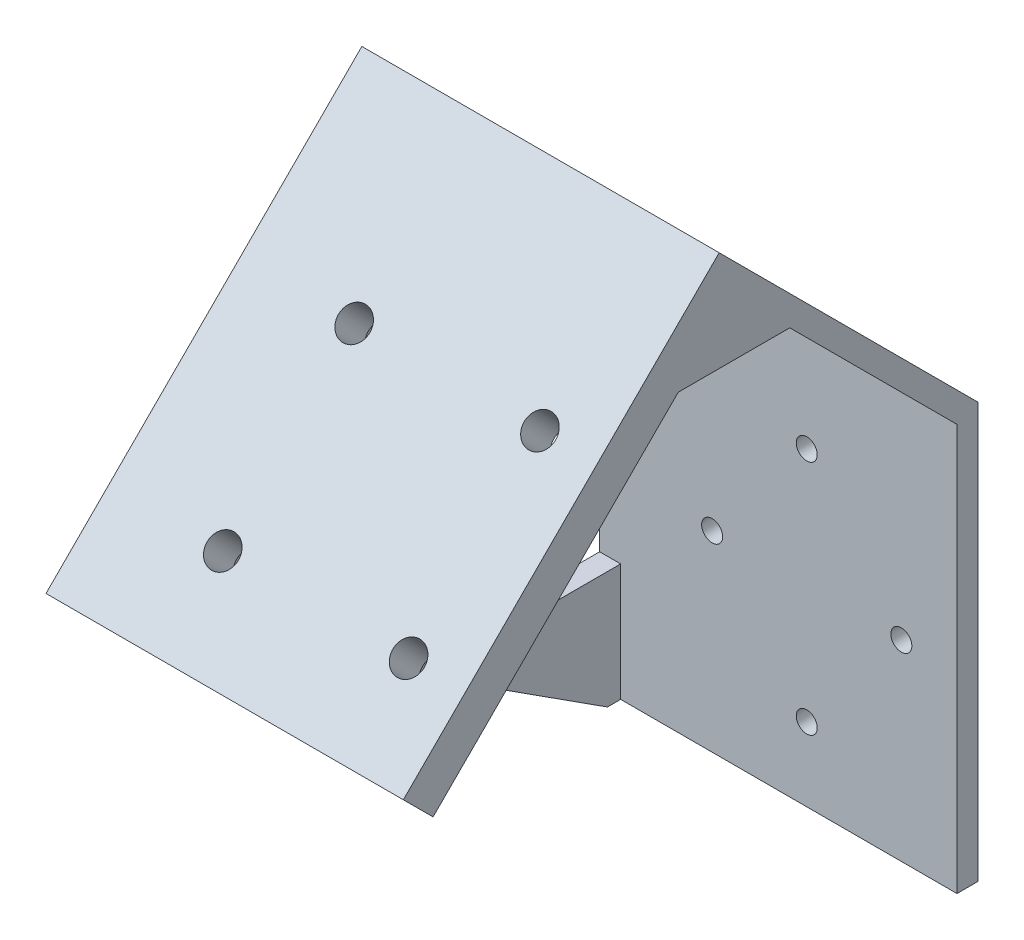
ISO-10303-21;
HEADER;
FILE_DESCRIPTION(('STEP AP214'),'2;1');
FILE_NAME('part.step','',(''),(''),'','','');
FILE_SCHEMA(('AUTOMOTIVE_DESIGN { 1 0 10303 214 1 1 1 1 }'));
ENDSEC;
DATA;
#1=APPLICATION_CONTEXT('core data for automotive mechanical design processes');
#2=APPLICATION_PROTOCOL_DEFINITION('international standard','automotive_design',2000,#1);
#3=PRODUCT_CONTEXT('',#1,'mechanical');
#4=PRODUCT('Part','Part','',(#3));
#5=PRODUCT_RELATED_PRODUCT_CATEGORY('part','',(#4));
#6=PRODUCT_DEFINITION_FORMATION('','',#4);
#7=PRODUCT_DEFINITION_CONTEXT('part definition',#1,'design');
#8=PRODUCT_DEFINITION('design','',#6,#7);
#9=PRODUCT_DEFINITION_SHAPE('','',#8);
#10=(LENGTH_UNIT() NAMED_UNIT(*) SI_UNIT(.MILLI.,.METRE.));
#11=(NAMED_UNIT(*) PLANE_ANGLE_UNIT() SI_UNIT($,.RADIAN.));
#12=(NAMED_UNIT(*) SI_UNIT($,.STERADIAN.) SOLID_ANGLE_UNIT());
#13=UNCERTAINTY_MEASURE_WITH_UNIT(LENGTH_MEASURE(1.E-05),#10,'distance_accuracy_value','');
#14=(GEOMETRIC_REPRESENTATION_CONTEXT(3) GLOBAL_UNCERTAINTY_ASSIGNED_CONTEXT((#13)) GLOBAL_UNIT_ASSIGNED_CONTEXT((#10,
#11,#12)) REPRESENTATION_CONTEXT('',''));
#15=CARTESIAN_POINT('',(0.,0.,0.));
#16=DIRECTION('',(0.,0.,1.));
#17=DIRECTION('',(1.,0.,0.));
#18=AXIS2_PLACEMENT_3D('',#15,#16,#17);
#19=CARTESIAN_POINT('',(-27.,10.5667806250409,-22.3044335614669));
#20=DIRECTION('',(0.,-1.,0.));
#21=DIRECTION('',(0.,0.,-1.));
#22=AXIS2_PLACEMENT_3D('',#19,#20,#21);
#23=PLANE('',#22);
#24=DIRECTION('',(1.,0.,0.));
#25=VECTOR('',#24,1.);
#26=CARTESIAN_POINT('',(-27.,10.5667806250409,-26.3044335614669));
#27=LINE('',#26,#25);
#28=CARTESIAN_POINT('',(-31.,10.5667806250409,-26.3044335614669));
#29=VERTEX_POINT('',#28);
#30=CARTESIAN_POINT('',(37.,10.5667806250409,-26.3044335614669));
#31=VERTEX_POINT('',#30);
#32=EDGE_CURVE('E271',#29,#31,#27,.T.);
#33=ORIENTED_EDGE('',*,*,#32,.T.);
#34=DIRECTION('',(0.,0.,-1.));
#35=VECTOR('',#34,1.);
#36=CARTESIAN_POINT('',(37.,10.5667806250409,-22.3044335614669));
#37=LINE('',#36,#35);
#38=CARTESIAN_POINT('',(37.,10.5667806250409,-22.3044335614669));
#39=VERTEX_POINT('',#38);
#40=EDGE_CURVE('E206',#39,#31,#37,.T.);
#41=ORIENTED_EDGE('',*,*,#40,.F.);
#42=DIRECTION('',(1.,0.,0.));
#43=VECTOR('',#42,1.);
#44=CARTESIAN_POINT('',(-27.,10.5667806250409,-22.3044335614669));
#45=LINE('',#44,#43);
#46=CARTESIAN_POINT('',(-27.,10.5667806250409,-22.3044335614665));
#47=VERTEX_POINT('',#46);
#48=EDGE_CURVE('E272',#47,#39,#45,.T.);
#49=ORIENTED_EDGE('',*,*,#48,.F.);
#50=DIRECTION('',(0.,0.,1.));
#51=VECTOR('',#50,1.);
#52=CARTESIAN_POINT('',(-27.,10.5667806250409,0.));
#53=LINE('',#52,#51);
#54=CARTESIAN_POINT('',(-27.,10.5667806250409,-19.7923121002212));
#55=VERTEX_POINT('',#54);
#56=EDGE_CURVE('E184',#47,#55,#53,.T.);
#57=ORIENTED_EDGE('',*,*,#56,.T.);
#58=DIRECTION('',(1.,0.,0.));
#59=VECTOR('',#58,1.);
#60=CARTESIAN_POINT('',(-31.,10.5667806250409,-19.7923121002212));
#61=LINE('',#60,#59);
#62=CARTESIAN_POINT('',(-31.,10.5667806250409,-19.7923121002212));
#63=VERTEX_POINT('',#62);
#64=EDGE_CURVE('E190',#63,#55,#61,.T.);
#65=ORIENTED_EDGE('',*,*,#64,.F.);
#66=DIRECTION('',(0.,0.,1.));
#67=VECTOR('',#66,1.);
#68=CARTESIAN_POINT('',(-31.,10.5667806250409,0.));
#69=LINE('',#68,#67);
#70=EDGE_CURVE('E324',#29,#63,#69,.T.);
#71=ORIENTED_EDGE('',*,*,#70,.F.);
#72=EDGE_LOOP('',(#33,#41,#49,#57,#65,#71));
#73=FACE_BOUND('',#72,.T.);
#74=ADVANCED_FACE('F49',(#73),#23,.T.);
#75=CARTESIAN_POINT('',(-27.,10.5667806250409,-22.3044335614669));
#76=DIRECTION('',(0.,0.,1.));
#77=DIRECTION('',(0.,-1.,0.));
#78=AXIS2_PLACEMENT_3D('',#75,#76,#77);
#79=PLANE('',#78);
#80=CARTESIAN_POINT('',(8.41,69.5667806250409,-22.3044335614671));
#81=DIRECTION('',(0.,0.,1.));
#82=DIRECTION('',(1.,0.,0.));
#83=AXIS2_PLACEMENT_3D('',#80,#81,#82);
#84=CIRCLE('',#83,2.);
#85=CARTESIAN_POINT('',(10.41,69.5667806250409,-22.3044335614671));
#86=VERTEX_POINT('',#85);
#87=EDGE_CURVE('E207',#86,#86,#84,.T.);
#88=ORIENTED_EDGE('',*,*,#87,.F.);
#89=EDGE_LOOP('',(#88));
#90=FACE_BOUND('',#89,.T.);
#91=CARTESIAN_POINT('',(26.41,47.0667806250409,-22.3044335614671));
#92=DIRECTION('',(0.,0.,1.));
#93=DIRECTION('',(1.,0.,0.));
#94=AXIS2_PLACEMENT_3D('',#91,#92,#93);
#95=CIRCLE('',#94,2.00000000000001);
#96=CARTESIAN_POINT('',(28.41,47.0667806250409,-22.3044335614671));
#97=VERTEX_POINT('',#96);
#98=EDGE_CURVE('E211',#97,#97,#95,.T.);
#99=ORIENTED_EDGE('',*,*,#98,.F.);
#100=EDGE_LOOP('',(#99));
#101=FACE_BOUND('',#100,.T.);
#102=CARTESIAN_POINT('',(8.41,24.5667806250409,-22.3044335614671));
#103=DIRECTION('',(0.,0.,1.));
#104=DIRECTION('',(1.,0.,0.));
#105=AXIS2_PLACEMENT_3D('',#102,#103,#104);
#106=CIRCLE('',#105,2.);
#107=CARTESIAN_POINT('',(10.41,24.5667806250409,-22.3044335614671));
#108=VERTEX_POINT('',#107);
#109=EDGE_CURVE('E219',#108,#108,#106,.T.);
#110=ORIENTED_EDGE('',*,*,#109,.F.);
#111=EDGE_LOOP('',(#110));
#112=FACE_BOUND('',#111,.T.);
#113=CARTESIAN_POINT('',(-9.59000000000001,47.0667806250409,-22.3044335614671));
#114=DIRECTION('',(0.,0.,1.));
#115=DIRECTION('',(1.,0.,0.));
#116=AXIS2_PLACEMENT_3D('',#113,#114,#115);
#117=CIRCLE('',#116,2.);
#118=CARTESIAN_POINT('',(-7.59,47.0667806250409,-22.3044335614671));
#119=VERTEX_POINT('',#118);
#120=EDGE_CURVE('E227',#119,#119,#117,.T.);
#121=ORIENTED_EDGE('',*,*,#120,.F.);
#122=EDGE_LOOP('',(#121));
#123=FACE_BOUND('',#122,.T.);
#124=ORIENTED_EDGE('',*,*,#48,.T.);
#125=DIRECTION('',(0.,-1.,0.));
#126=VECTOR('',#125,1.);
#127=CARTESIAN_POINT('',(37.,10.5667806250409,-22.3044335614669));
#128=LINE('',#127,#126);
#129=CARTESIAN_POINT('',(37.,87.8961406723631,-22.3044335614661));
#130=VERTEX_POINT('',#129);
#131=EDGE_CURVE('E261',#130,#39,#128,.T.);
#132=ORIENTED_EDGE('',*,*,#131,.F.);
#133=DIRECTION('',(1.,0.,0.));
#134=VECTOR('',#133,1.);
#135=CARTESIAN_POINT('',(-27.,87.8961406723631,-22.3044335614661));
#136=LINE('',#135,#134);
#137=CARTESIAN_POINT('',(-27.,87.8961406723631,-22.3044335614661));
#138=VERTEX_POINT('',#137);
#139=EDGE_CURVE('E276',#138,#130,#136,.T.);
#140=ORIENTED_EDGE('',*,*,#139,.F.);
#141=DIRECTION('',(1.,0.,0.));
#142=VECTOR('',#141,1.);
#143=CARTESIAN_POINT('',(-31.,87.8961406723631,-22.3044335614661));
#144=LINE('',#143,#142);
#145=CARTESIAN_POINT('',(-31.,87.8961406723631,-22.3044335614661));
#146=VERTEX_POINT('',#145);
#147=EDGE_CURVE('E168',#146,#138,#144,.T.);
#148=ORIENTED_EDGE('',*,*,#147,.F.);
#149=DIRECTION('',(0.,1.,0.));
#150=VECTOR('',#149,1.);
#151=CARTESIAN_POINT('',(-31.,2.38168318721785E-13,-22.3044335614671));
#152=LINE('',#151,#150);
#153=CARTESIAN_POINT('',(-31.,32.8961406723631,-22.3044335614667));
#154=VERTEX_POINT('',#153);
#155=EDGE_CURVE('E159',#154,#146,#152,.T.);
#156=ORIENTED_EDGE('',*,*,#155,.F.);
#157=DIRECTION('',(1.,0.,0.));
#158=VECTOR('',#157,1.);
#159=CARTESIAN_POINT('',(-31.,32.8961406723631,-22.3044335614667));
#160=LINE('',#159,#158);
#161=CARTESIAN_POINT('',(-27.,32.8961406723631,-22.3044335614667));
#162=VERTEX_POINT('',#161);
#163=EDGE_CURVE('E164',#154,#162,#160,.T.);
#164=ORIENTED_EDGE('',*,*,#163,.T.);
#165=DIRECTION('',(0.,-1.,0.));
#166=VECTOR('',#165,1.);
#167=CARTESIAN_POINT('',(-27.,10.5667806250409,-22.3044335614669));
#168=LINE('',#167,#166);
#169=EDGE_CURVE('E268',#162,#47,#168,.T.);
#170=ORIENTED_EDGE('',*,*,#169,.T.);
#171=EDGE_LOOP('',(#124,#132,#140,#148,#156,#164,#170));
#172=FACE_BOUND('',#171,.T.);
#173=ADVANCED_FACE('F161',(#90,#101,#112,#123,#172),#79,.T.);
#174=CARTESIAN_POINT('',(-27.,130.322547543556,20.1219733097267));
#175=DIRECTION('',(0.,-0.707106781186548,0.707106781186548));
#176=DIRECTION('',(0.,-0.707106781186548,-0.707106781186548));
#177=AXIS2_PLACEMENT_3D('',#174,#175,#176);
#178=PLANE('',#177);
#179=DIRECTION('',(0.,-0.707106781186547,-0.707106781186547));
#180=VECTOR('',#179,1.);
#181=CARTESIAN_POINT('',(37.,130.322547543556,20.1219733097267));
#182=LINE('',#181,#180);
#183=CARTESIAN_POINT('',(37.,119.715945825758,9.51537159192855));
#184=VERTEX_POINT('',#183);
#185=EDGE_CURVE('E258',#184,#130,#182,.T.);
#186=ORIENTED_EDGE('',*,*,#185,.F.);
#187=DIRECTION('',(-1.,0.,0.));
#188=VECTOR('',#187,1.);
#189=CARTESIAN_POINT('',(-27.,119.715945825758,9.51537159192855));
#190=LINE('',#189,#188);
#191=CARTESIAN_POINT('',(-27.,119.715945825758,9.51537159192855));
#192=VERTEX_POINT('',#191);
#193=EDGE_CURVE('E295',#184,#192,#190,.T.);
#194=ORIENTED_EDGE('',*,*,#193,.T.);
#195=DIRECTION('',(0.,-0.707106781186547,-0.707106781186547));
#196=VECTOR('',#195,1.);
#197=CARTESIAN_POINT('',(-27.,130.322547543556,20.1219733097267));
#198=LINE('',#197,#196);
#199=EDGE_CURVE('E265',#192,#138,#198,.T.);
#200=ORIENTED_EDGE('',*,*,#199,.T.);
#201=ORIENTED_EDGE('',*,*,#139,.T.);
#202=EDGE_LOOP('',(#186,#194,#200,#201));
#203=FACE_BOUND('',#202,.T.);
#204=ADVANCED_FACE('F399',(#203),#178,.T.);
#205=CARTESIAN_POINT('',(-27.,73.0468982674459,77.3976225858368));
#206=DIRECTION('',(0.,-0.707106781186548,-0.707106781186547));
#207=DIRECTION('',(0.,0.707106781186547,-0.707106781186548));
#208=AXIS2_PLACEMENT_3D('',#205,#206,#207);
#209=PLANE('',#208);
#210=CARTESIAN_POINT('',(26.0876695296637,109.958724290234,40.4857965630484));
#211=DIRECTION('',(0.,-0.707106781186548,-0.707106781186547));
#212=DIRECTION('',(0.,0.707106781186547,-0.707106781186548));
#213=AXIS2_PLACEMENT_3D('',#210,#211,#212);
#214=CIRCLE('',#213,3.00000000000001);
#215=CARTESIAN_POINT('',(26.0876695296637,112.080044633794,38.3644762194888));
#216=VERTEX_POINT('',#215);
#217=EDGE_CURVE('E372',#216,#216,#214,.F.);
#218=ORIENTED_EDGE('',*,*,#217,.T.);
#219=EDGE_LOOP('',(#218));
#220=FACE_BOUND('',#219,.T.);
#221=CARTESIAN_POINT('',(26.0876695296637,84.9587242902343,65.4857965630484));
#222=DIRECTION('',(0.,-0.707106781186548,-0.707106781186547));
#223=DIRECTION('',(0.,0.707106781186547,-0.707106781186548));
#224=AXIS2_PLACEMENT_3D('',#221,#222,#223);
#225=CIRCLE('',#224,3.00000000000001);
#226=CARTESIAN_POINT('',(26.0876695296637,87.0800446337939,63.3644762194888));
#227=VERTEX_POINT('',#226);
#228=EDGE_CURVE('E333',#227,#227,#225,.F.);
#229=ORIENTED_EDGE('',*,*,#228,.T.);
#230=EDGE_LOOP('',(#229));
#231=FACE_BOUND('',#230,.T.);
#232=CARTESIAN_POINT('',(-9.26766952966368,84.9587242902343,65.4857965630484));
#233=DIRECTION('',(0.,-0.707106781186548,-0.707106781186547));
#234=DIRECTION('',(0.,0.707106781186547,-0.707106781186548));
#235=AXIS2_PLACEMENT_3D('',#232,#233,#234);
#236=CIRCLE('',#235,3.);
#237=CARTESIAN_POINT('',(-9.26766952966368,87.0800446337939,63.3644762194888));
#238=VERTEX_POINT('',#237);
#239=EDGE_CURVE('E331',#238,#238,#236,.F.);
#240=ORIENTED_EDGE('',*,*,#239,.T.);
#241=EDGE_LOOP('',(#240));
#242=FACE_BOUND('',#241,.T.);
#243=CARTESIAN_POINT('',(-9.2676695296637,109.958724290234,40.4857965630484));
#244=DIRECTION('',(0.,-0.707106781186548,-0.707106781186547));
#245=DIRECTION('',(0.,0.707106781186547,-0.707106781186548));
#246=AXIS2_PLACEMENT_3D('',#243,#244,#245);
#247=CIRCLE('',#246,3.00000000000001);
#248=CARTESIAN_POINT('',(-9.2676695296637,112.080044633794,38.3644762194888));
#249=VERTEX_POINT('',#248);
#250=EDGE_CURVE('E334',#249,#249,#247,.F.);
#251=ORIENTED_EDGE('',*,*,#250,.T.);
#252=EDGE_LOOP('',(#251));
#253=FACE_BOUND('',#252,.T.);
#254=DIRECTION('',(1.,0.,0.));
#255=VECTOR('',#254,1.);
#256=CARTESIAN_POINT('',(-27.,73.0468982674459,77.3976225858368));
#257=LINE('',#256,#255);
#258=CARTESIAN_POINT('',(-16.9999999999999,73.0468982674459,77.3976225858368));
#259=VERTEX_POINT('',#258);
#260=CARTESIAN_POINT('',(37.,73.0468982674459,77.3976225858368));
#261=VERTEX_POINT('',#260);
#262=EDGE_CURVE('E279',#259,#261,#257,.T.);
#263=ORIENTED_EDGE('',*,*,#262,.F.);
#264=DIRECTION('',(0.,0.707106781186547,-0.707106781186548));
#265=VECTOR('',#264,1.);
#266=CARTESIAN_POINT('',(-16.9999999999999,73.0468982674459,77.3976225858368));
#267=LINE('',#266,#265);
#268=CARTESIAN_POINT('',(-16.9999999999999,119.715945825758,30.728575027525));
#269=VERTEX_POINT('',#268);
#270=EDGE_CURVE('E304',#259,#269,#267,.T.);
#271=ORIENTED_EDGE('',*,*,#270,.T.);
#272=DIRECTION('',(1.,0.,0.));
#273=VECTOR('',#272,1.);
#274=CARTESIAN_POINT('',(37.,119.715945825758,30.728575027525));
#275=LINE('',#274,#273);
#276=CARTESIAN_POINT('',(37.,119.715945825758,30.728575027525));
#277=VERTEX_POINT('',#276);
#278=EDGE_CURVE('E275',#269,#277,#275,.T.);
#279=ORIENTED_EDGE('',*,*,#278,.T.);
#280=DIRECTION('',(0.,0.707106781186547,-0.707106781186548));
#281=VECTOR('',#280,1.);
#282=CARTESIAN_POINT('',(37.,73.0468982674459,77.3976225858368));
#283=LINE('',#282,#281);
#284=EDGE_CURVE('E254',#261,#277,#283,.T.);
#285=ORIENTED_EDGE('',*,*,#284,.F.);
#286=EDGE_LOOP('',(#263,#271,#279,#285));
#287=FACE_BOUND('',#286,.T.);
#288=ADVANCED_FACE('F424',(#220,#231,#242,#253,#287),#209,.T.);
#289=CARTESIAN_POINT('',(-27.,78.7037525169383,83.0544768353292));
#290=DIRECTION('',(0.,-0.707106781186548,0.707106781186547));
#291=DIRECTION('',(0.,-0.707106781186547,-0.707106781186548));
#292=AXIS2_PLACEMENT_3D('',#289,#290,#291);
#293=PLANE('',#292);
#294=DIRECTION('',(1.,0.,0.));
#295=VECTOR('',#294,1.);
#296=CARTESIAN_POINT('',(-31.,73.0468982674459,77.3976225858368));
#297=LINE('',#296,#295);
#298=CARTESIAN_POINT('',(-31.,73.0468982674459,77.3976225858368));
#299=VERTEX_POINT('',#298);
#300=EDGE_CURVE('E66',#299,#259,#297,.T.);
#301=ORIENTED_EDGE('',*,*,#300,.T.);
#302=ORIENTED_EDGE('',*,*,#262,.T.);
#303=DIRECTION('',(0.,-0.707106781186547,-0.707106781186548));
#304=VECTOR('',#303,1.);
#305=CARTESIAN_POINT('',(37.,78.7037525169383,83.0544768353292));
#306=LINE('',#305,#304);
#307=CARTESIAN_POINT('',(37.,78.7037525169383,83.0544768353292));
#308=VERTEX_POINT('',#307);
#309=EDGE_CURVE('E250',#308,#261,#306,.T.);
#310=ORIENTED_EDGE('',*,*,#309,.F.);
#311=DIRECTION('',(1.,0.,0.));
#312=VECTOR('',#311,1.);
#313=CARTESIAN_POINT('',(-27.,78.7037525169383,83.0544768353292));
#314=LINE('',#313,#312);
#315=CARTESIAN_POINT('',(-31.,78.7037525169383,83.0544768353292));
#316=VERTEX_POINT('',#315);
#317=EDGE_CURVE('E282',#316,#308,#314,.T.);
#318=ORIENTED_EDGE('',*,*,#317,.F.);
#319=DIRECTION('',(0.,0.707106781186547,0.707106781186548));
#320=VECTOR('',#319,1.);
#321=CARTESIAN_POINT('',(-31.,-2.17536215919535,2.17536215919535));
#322=LINE('',#321,#320);
#323=EDGE_CURVE('E351',#299,#316,#322,.T.);
#324=ORIENTED_EDGE('',*,*,#323,.F.);
#325=EDGE_LOOP('',(#301,#302,#310,#318,#324));
#326=FACE_BOUND('',#325,.T.);
#327=ADVANCED_FACE('F420',(#326),#293,.T.);
#328=CARTESIAN_POINT('',(-27.,78.7037525169383,83.0544768353292));
#329=DIRECTION('',(0.,0.707106781186548,0.707106781186547));
#330=DIRECTION('',(0.,-0.707106781186547,0.707106781186548));
#331=AXIS2_PLACEMENT_3D('',#328,#329,#330);
#332=PLANE('',#331);
#333=CARTESIAN_POINT('',(26.0876695296637,115.615578539726,46.1426508125406));
#334=DIRECTION('',(0.,-0.707106781186547,-0.707106781186548));
#335=DIRECTION('',(0.,0.707106781186548,-0.707106781186547));
#336=AXIS2_PLACEMENT_3D('',#333,#334,#335);
#337=CIRCLE('',#336,3.00000000000001);
#338=CARTESIAN_POINT('',(26.0876695296637,117.736898883286,44.0213304689809));
#339=VERTEX_POINT('',#338);
#340=EDGE_CURVE('E329',#339,#339,#337,.T.);
#341=ORIENTED_EDGE('',*,*,#340,.T.);
#342=EDGE_LOOP('',(#341));
#343=FACE_BOUND('',#342,.T.);
#344=CARTESIAN_POINT('',(26.0876695296637,90.6155785397264,71.1426508125406));
#345=DIRECTION('',(0.,-0.707106781186547,-0.707106781186548));
#346=DIRECTION('',(0.,0.707106781186548,-0.707106781186547));
#347=AXIS2_PLACEMENT_3D('',#344,#345,#346);
#348=CIRCLE('',#347,3.00000000000001);
#349=CARTESIAN_POINT('',(26.0876695296637,92.7368988832861,69.0213304689809));
#350=VERTEX_POINT('',#349);
#351=EDGE_CURVE('E315',#350,#350,#348,.T.);
#352=ORIENTED_EDGE('',*,*,#351,.T.);
#353=EDGE_LOOP('',(#352));
#354=FACE_BOUND('',#353,.T.);
#355=CARTESIAN_POINT('',(-9.26766952966368,90.6155785397264,71.1426508125406));
#356=DIRECTION('',(0.,-0.707106781186547,-0.707106781186548));
#357=DIRECTION('',(0.,0.707106781186548,-0.707106781186547));
#358=AXIS2_PLACEMENT_3D('',#355,#356,#357);
#359=CIRCLE('',#358,3.);
#360=CARTESIAN_POINT('',(-9.26766952966368,92.7368988832861,69.0213304689809));
#361=VERTEX_POINT('',#360);
#362=EDGE_CURVE('E312',#361,#361,#359,.T.);
#363=ORIENTED_EDGE('',*,*,#362,.T.);
#364=EDGE_LOOP('',(#363));
#365=FACE_BOUND('',#364,.T.);
#366=CARTESIAN_POINT('',(-9.2676695296637,115.615578539726,46.1426508125406));
#367=DIRECTION('',(0.,-0.707106781186547,-0.707106781186548));
#368=DIRECTION('',(0.,0.707106781186548,-0.707106781186547));
#369=AXIS2_PLACEMENT_3D('',#366,#367,#368);
#370=CIRCLE('',#369,3.00000000000001);
#371=CARTESIAN_POINT('',(-9.2676695296637,117.736898883286,44.0213304689809));
#372=VERTEX_POINT('',#371);
#373=EDGE_CURVE('E314',#372,#372,#370,.T.);
#374=ORIENTED_EDGE('',*,*,#373,.T.);
#375=EDGE_LOOP('',(#374));
#376=FACE_BOUND('',#375,.T.);
#377=ORIENTED_EDGE('',*,*,#317,.T.);
#378=DIRECTION('',(0.,-0.707106781186547,0.707106781186548));
#379=VECTOR('',#378,1.);
#380=CARTESIAN_POINT('',(37.,78.7037525169383,83.0544768353292));
#381=LINE('',#380,#379);
#382=CARTESIAN_POINT('',(37.,138.807828917795,22.9504004344729));
#383=VERTEX_POINT('',#382);
#384=EDGE_CURVE('E246',#383,#308,#381,.T.);
#385=ORIENTED_EDGE('',*,*,#384,.F.);
#386=DIRECTION('',(1.,0.,0.));
#387=VECTOR('',#386,1.);
#388=CARTESIAN_POINT('',(-27.,138.807828917795,22.9504004344729));
#389=LINE('',#388,#387);
#390=CARTESIAN_POINT('',(-31.,138.807828917795,22.9504004344729));
#391=VERTEX_POINT('',#390);
#392=EDGE_CURVE('E285',#391,#383,#389,.T.);
#393=ORIENTED_EDGE('',*,*,#392,.F.);
#394=DIRECTION('',(0.,0.707106781186547,-0.707106781186548));
#395=VECTOR('',#394,1.);
#396=CARTESIAN_POINT('',(-31.,80.8791146761338,80.8791146761337));
#397=LINE('',#396,#395);
#398=EDGE_CURVE('E349',#316,#391,#397,.T.);
#399=ORIENTED_EDGE('',*,*,#398,.F.);
#400=EDGE_LOOP('',(#377,#385,#393,#399));
#401=FACE_BOUND('',#400,.T.);
#402=ADVANCED_FACE('F416',(#343,#354,#365,#376,#401),#332,.T.);
#403=CARTESIAN_POINT('',(-27.,89.5529949218547,-26.3044335614669));
#404=DIRECTION('',(0.,0.707106781186548,-0.707106781186547));
#405=DIRECTION('',(0.,0.707106781186547,0.707106781186548));
#406=AXIS2_PLACEMENT_3D('',#403,#404,#405);
#407=PLANE('',#406);
#408=ORIENTED_EDGE('',*,*,#392,.T.);
#409=DIRECTION('',(0.,0.707106781186547,0.707106781186548));
#410=VECTOR('',#409,1.);
#411=CARTESIAN_POINT('',(37.,89.5529949218547,-26.3044335614669));
#412=LINE('',#411,#410);
#413=CARTESIAN_POINT('',(37.,89.5529949218547,-26.3044335614669));
#414=VERTEX_POINT('',#413);
#415=EDGE_CURVE('E242',#414,#383,#412,.T.);
#416=ORIENTED_EDGE('',*,*,#415,.F.);
#417=DIRECTION('',(1.,0.,0.));
#418=VECTOR('',#417,1.);
#419=CARTESIAN_POINT('',(-27.,89.5529949218547,-26.3044335614669));
#420=LINE('',#419,#418);
#421=CARTESIAN_POINT('',(-31.,89.5529949218546,-26.3044335614669));
#422=VERTEX_POINT('',#421);
#423=EDGE_CURVE('E288',#422,#414,#420,.T.);
#424=ORIENTED_EDGE('',*,*,#423,.F.);
#425=DIRECTION('',(0.,-0.707106781186547,-0.707106781186548));
#426=VECTOR('',#425,1.);
#427=CARTESIAN_POINT('',(-31.,57.9287142416608,-57.9287142416608));
#428=LINE('',#427,#426);
#429=EDGE_CURVE('E325',#391,#422,#428,.T.);
#430=ORIENTED_EDGE('',*,*,#429,.F.);
#431=EDGE_LOOP('',(#408,#416,#424,#430));
#432=FACE_BOUND('',#431,.T.);
#433=ADVANCED_FACE('F412',(#432),#407,.T.);
#434=CARTESIAN_POINT('',(-27.,10.5667806250409,-26.3044335614669));
#435=DIRECTION('',(0.,0.,-1.));
#436=DIRECTION('',(-1.,0.,0.));
#437=AXIS2_PLACEMENT_3D('',#434,#435,#436);
#438=PLANE('',#437);
#439=CARTESIAN_POINT('',(8.41,69.5667806250409,-26.3044335614669));
#440=DIRECTION('',(0.,0.,1.));
#441=DIRECTION('',(1.,0.,0.));
#442=AXIS2_PLACEMENT_3D('',#439,#440,#441);
#443=CIRCLE('',#442,2.);
#444=CARTESIAN_POINT('',(10.41,69.5667806250409,-26.3044335614669));
#445=VERTEX_POINT('',#444);
#446=EDGE_CURVE('E202',#445,#445,#443,.T.);
#447=ORIENTED_EDGE('',*,*,#446,.T.);
#448=EDGE_LOOP('',(#447));
#449=FACE_BOUND('',#448,.T.);
#450=CARTESIAN_POINT('',(26.41,47.0667806250409,-26.3044335614669));
#451=DIRECTION('',(0.,0.,1.));
#452=DIRECTION('',(1.,0.,0.));
#453=AXIS2_PLACEMENT_3D('',#450,#451,#452);
#454=CIRCLE('',#453,2.00000000000001);
#455=CARTESIAN_POINT('',(28.41,47.0667806250409,-26.3044335614669));
#456=VERTEX_POINT('',#455);
#457=EDGE_CURVE('E215',#456,#456,#454,.T.);
#458=ORIENTED_EDGE('',*,*,#457,.T.);
#459=EDGE_LOOP('',(#458));
#460=FACE_BOUND('',#459,.T.);
#461=CARTESIAN_POINT('',(8.41,24.5667806250409,-26.3044335614669));
#462=DIRECTION('',(0.,0.,1.));
#463=DIRECTION('',(1.,0.,0.));
#464=AXIS2_PLACEMENT_3D('',#461,#462,#463);
#465=CIRCLE('',#464,2.);
#466=CARTESIAN_POINT('',(10.41,24.5667806250409,-26.3044335614669));
#467=VERTEX_POINT('',#466);
#468=EDGE_CURVE('E223',#467,#467,#465,.T.);
#469=ORIENTED_EDGE('',*,*,#468,.T.);
#470=EDGE_LOOP('',(#469));
#471=FACE_BOUND('',#470,.T.);
#472=CARTESIAN_POINT('',(-9.59000000000001,47.0667806250409,-26.3044335614669));
#473=DIRECTION('',(0.,0.,1.));
#474=DIRECTION('',(1.,0.,0.));
#475=AXIS2_PLACEMENT_3D('',#472,#473,#474);
#476=CIRCLE('',#475,2.);
#477=CARTESIAN_POINT('',(-7.59,47.0667806250409,-26.3044335614669));
#478=VERTEX_POINT('',#477);
#479=EDGE_CURVE('E231',#478,#478,#476,.T.);
#480=ORIENTED_EDGE('',*,*,#479,.T.);
#481=EDGE_LOOP('',(#480));
#482=FACE_BOUND('',#481,.T.);
#483=ORIENTED_EDGE('',*,*,#423,.T.);
#484=DIRECTION('',(0.,1.,0.));
#485=VECTOR('',#484,1.);
#486=CARTESIAN_POINT('',(37.,10.5667806250409,-26.3044335614669));
#487=LINE('',#486,#485);
#488=EDGE_CURVE('E238',#31,#414,#487,.T.);
#489=ORIENTED_EDGE('',*,*,#488,.F.);
#490=ORIENTED_EDGE('',*,*,#32,.F.);
#491=DIRECTION('',(0.,-1.,0.));
#492=VECTOR('',#491,1.);
#493=CARTESIAN_POINT('',(-31.,0.,-26.3044335614669));
#494=LINE('',#493,#492);
#495=EDGE_CURVE('E321',#422,#29,#494,.T.);
#496=ORIENTED_EDGE('',*,*,#495,.F.);
#497=EDGE_LOOP('',(#483,#489,#490,#496));
#498=FACE_BOUND('',#497,.T.);
#499=ADVANCED_FACE('F403',(#449,#460,#471,#482,#498),#438,.T.);
#500=CARTESIAN_POINT('',(37.,0.,0.));
#501=DIRECTION('',(1.,0.,0.));
#502=DIRECTION('',(0.,0.,-1.));
#503=AXIS2_PLACEMENT_3D('',#500,#501,#502);
#504=PLANE('',#503);
#505=ORIENTED_EDGE('',*,*,#40,.T.);
#506=ORIENTED_EDGE('',*,*,#488,.T.);
#507=ORIENTED_EDGE('',*,*,#415,.T.);
#508=ORIENTED_EDGE('',*,*,#384,.T.);
#509=ORIENTED_EDGE('',*,*,#309,.T.);
#510=ORIENTED_EDGE('',*,*,#284,.T.);
#511=DIRECTION('',(0.,0.,1.));
#512=VECTOR('',#511,1.);
#513=CARTESIAN_POINT('',(37.,119.715945825758,30.728575027525));
#514=LINE('',#513,#512);
#515=EDGE_CURVE('E301',#277,#184,#514,.F.);
#516=ORIENTED_EDGE('',*,*,#515,.T.);
#517=ORIENTED_EDGE('',*,*,#185,.T.);
#518=ORIENTED_EDGE('',*,*,#131,.T.);
#519=EDGE_LOOP('',(#505,#506,#507,#508,#509,#510,#516,#517,#518));
#520=FACE_BOUND('',#519,.T.);
#521=ADVANCED_FACE('F411',(#520),#504,.T.);
#522=CARTESIAN_POINT('',(-9.59000000000001,47.0667806250409,-26.3044335614669));
#523=DIRECTION('',(0.,0.,1.));
#524=DIRECTION('',(1.,0.,0.));
#525=AXIS2_PLACEMENT_3D('',#522,#523,#524);
#526=CYLINDRICAL_SURFACE('',#525,2.);
#527=ORIENTED_EDGE('',*,*,#479,.F.);
#528=EDGE_LOOP('',(#527));
#529=FACE_BOUND('',#528,.T.);
#530=ORIENTED_EDGE('',*,*,#120,.T.);
#531=EDGE_LOOP('',(#530));
#532=FACE_BOUND('',#531,.T.);
#533=ADVANCED_FACE('F433',(#529,#532),#526,.F.);
#534=CARTESIAN_POINT('',(8.41,24.5667806250409,-26.3044335614669));
#535=DIRECTION('',(0.,0.,1.));
#536=DIRECTION('',(1.,0.,0.));
#537=AXIS2_PLACEMENT_3D('',#534,#535,#536);
#538=CYLINDRICAL_SURFACE('',#537,2.);
#539=ORIENTED_EDGE('',*,*,#468,.F.);
#540=EDGE_LOOP('',(#539));
#541=FACE_BOUND('',#540,.T.);
#542=ORIENTED_EDGE('',*,*,#109,.T.);
#543=EDGE_LOOP('',(#542));
#544=FACE_BOUND('',#543,.T.);
#545=ADVANCED_FACE('F437',(#541,#544),#538,.F.);
#546=CARTESIAN_POINT('',(26.41,47.0667806250409,-26.3044335614669));
#547=DIRECTION('',(0.,0.,1.));
#548=DIRECTION('',(1.,0.,0.));
#549=AXIS2_PLACEMENT_3D('',#546,#547,#548);
#550=CYLINDRICAL_SURFACE('',#549,2.00000000000001);
#551=ORIENTED_EDGE('',*,*,#457,.F.);
#552=EDGE_LOOP('',(#551));
#553=FACE_BOUND('',#552,.T.);
#554=ORIENTED_EDGE('',*,*,#98,.T.);
#555=EDGE_LOOP('',(#554));
#556=FACE_BOUND('',#555,.T.);
#557=ADVANCED_FACE('F441',(#553,#556),#550,.F.);
#558=CARTESIAN_POINT('',(8.41,69.5667806250409,-26.3044335614669));
#559=DIRECTION('',(0.,0.,1.));
#560=DIRECTION('',(1.,0.,0.));
#561=AXIS2_PLACEMENT_3D('',#558,#559,#560);
#562=CYLINDRICAL_SURFACE('',#561,2.);
#563=ORIENTED_EDGE('',*,*,#446,.F.);
#564=EDGE_LOOP('',(#563));
#565=FACE_BOUND('',#564,.T.);
#566=ORIENTED_EDGE('',*,*,#87,.T.);
#567=EDGE_LOOP('',(#566));
#568=FACE_BOUND('',#567,.T.);
#569=ADVANCED_FACE('F445',(#565,#568),#562,.F.);
#570=CARTESIAN_POINT('',(-31.,16.4798478933321,-10.5943361154665));
#571=DIRECTION('',(0.,0.84117503482929,-0.540762943238479));
#572=DIRECTION('',(0.,0.540762943238479,0.84117503482929));
#573=AXIS2_PLACEMENT_3D('',#570,#571,#572);
#574=PLANE('',#573);
#575=DIRECTION('',(0.,0.540762943238479,0.84117503482929));
#576=VECTOR('',#575,1.);
#577=CARTESIAN_POINT('',(-27.,16.4798478933321,-10.5943361154665));
#578=LINE('',#577,#576);
#579=CARTESIAN_POINT('',(-27.,67.5129719951111,68.7894132344407));
#580=VERTEX_POINT('',#579);
#581=EDGE_CURVE('E342',#55,#580,#578,.T.);
#582=ORIENTED_EDGE('',*,*,#581,.T.);
#583=DIRECTION('',(0.698898188767093,0.386765104850539,0.601626192421863));
#584=VECTOR('',#583,1.);
#585=CARTESIAN_POINT('',(-76.1274876869849,40.3261825146303,26.4994433426711));
#586=LINE('',#585,#584);
#587=EDGE_CURVE('E11',#580,#259,#586,.T.);
#588=ORIENTED_EDGE('',*,*,#587,.T.);
#589=ORIENTED_EDGE('',*,*,#300,.F.);
#590=DIRECTION('',(0.,0.540762943238479,0.84117503482929));
#591=VECTOR('',#590,1.);
#592=CARTESIAN_POINT('',(-31.,16.4798478933321,-10.5943361154665));
#593=LINE('',#592,#591);
#594=EDGE_CURVE('E353',#63,#299,#593,.T.);
#595=ORIENTED_EDGE('',*,*,#594,.F.);
#596=ORIENTED_EDGE('',*,*,#64,.T.);
#597=EDGE_LOOP('',(#582,#588,#589,#595,#596));
#598=FACE_BOUND('',#597,.T.);
#599=ADVANCED_FACE('F379',(#598),#574,.F.);
#600=CARTESIAN_POINT('',(-31.,32.8961406723631,0.));
#601=DIRECTION('',(0.,-1.,0.));
#602=DIRECTION('',(0.,0.,-1.));
#603=AXIS2_PLACEMENT_3D('',#600,#601,#602);
#604=PLANE('',#603);
#605=DIRECTION('',(0.,0.,-1.));
#606=VECTOR('',#605,1.);
#607=CARTESIAN_POINT('',(-27.,32.8961406723631,0.));
#608=LINE('',#607,#606);
#609=CARTESIAN_POINT('',(-27.,32.8961406723631,5.69556643853389));
#610=VERTEX_POINT('',#609);
#611=EDGE_CURVE('E188',#610,#162,#608,.T.);
#612=ORIENTED_EDGE('',*,*,#611,.T.);
#613=ORIENTED_EDGE('',*,*,#163,.F.);
#614=DIRECTION('',(0.,0.,-1.));
#615=VECTOR('',#614,1.);
#616=CARTESIAN_POINT('',(-31.,32.8961406723631,0.));
#617=LINE('',#616,#615);
#618=CARTESIAN_POINT('',(-31.,32.8961406723631,5.69556643853389));
#619=VERTEX_POINT('',#618);
#620=EDGE_CURVE('E173',#619,#154,#617,.T.);
#621=ORIENTED_EDGE('',*,*,#620,.F.);
#622=DIRECTION('',(1.,0.,0.));
#623=VECTOR('',#622,1.);
#624=CARTESIAN_POINT('',(-31.,32.8961406723631,5.69556643853389));
#625=LINE('',#624,#623);
#626=EDGE_CURVE('E320',#619,#610,#625,.T.);
#627=ORIENTED_EDGE('',*,*,#626,.T.);
#628=EDGE_LOOP('',(#612,#613,#621,#627));
#629=FACE_BOUND('',#628,.T.);
#630=ADVANCED_FACE('F186',(#629),#604,.F.);
#631=CARTESIAN_POINT('',(-31.,87.8961406723631,0.));
#632=DIRECTION('',(0.,1.,0.));
#633=DIRECTION('',(0.,0.,1.));
#634=AXIS2_PLACEMENT_3D('',#631,#632,#633);
#635=PLANE('',#634);
#636=DIRECTION('',(0.,0.,1.));
#637=VECTOR('',#636,1.);
#638=CARTESIAN_POINT('',(-27.,87.8961406723631,0.));
#639=LINE('',#638,#637);
#640=CARTESIAN_POINT('',(-27.,87.8961406723631,5.69556643853389));
#641=VERTEX_POINT('',#640);
#642=EDGE_CURVE('E343',#138,#641,#639,.T.);
#643=ORIENTED_EDGE('',*,*,#642,.T.);
#644=DIRECTION('',(1.,0.,0.));
#645=VECTOR('',#644,1.);
#646=CARTESIAN_POINT('',(-31.,87.8961406723631,5.69556643853389));
#647=LINE('',#646,#645);
#648=CARTESIAN_POINT('',(-31.,87.8961406723631,5.69556643853389));
#649=VERTEX_POINT('',#648);
#650=EDGE_CURVE('E198',#649,#641,#647,.T.);
#651=ORIENTED_EDGE('',*,*,#650,.F.);
#652=DIRECTION('',(0.,0.,1.));
#653=VECTOR('',#652,1.);
#654=CARTESIAN_POINT('',(-31.,87.8961406723631,0.));
#655=LINE('',#654,#653);
#656=EDGE_CURVE('E172',#146,#649,#655,.T.);
#657=ORIENTED_EDGE('',*,*,#656,.F.);
#658=ORIENTED_EDGE('',*,*,#147,.T.);
#659=EDGE_LOOP('',(#643,#651,#657,#658));
#660=FACE_BOUND('',#659,.T.);
#661=ADVANCED_FACE('F452',(#660),#635,.F.);
#662=CARTESIAN_POINT('',(-31.,0.,5.6955664385339));
#663=DIRECTION('',(0.,0.,1.));
#664=DIRECTION('',(0.,-1.,0.));
#665=AXIS2_PLACEMENT_3D('',#662,#663,#664);
#666=PLANE('',#665);
#667=DIRECTION('',(0.,-1.,0.));
#668=VECTOR('',#667,1.);
#669=CARTESIAN_POINT('',(-27.,0.,5.6955664385339));
#670=LINE('',#669,#668);
#671=EDGE_CURVE('E340',#641,#610,#670,.T.);
#672=ORIENTED_EDGE('',*,*,#671,.T.);
#673=ORIENTED_EDGE('',*,*,#626,.F.);
#674=DIRECTION('',(0.,-1.,0.));
#675=VECTOR('',#674,1.);
#676=CARTESIAN_POINT('',(-31.,0.,5.6955664385339));
#677=LINE('',#676,#675);
#678=EDGE_CURVE('E179',#649,#619,#677,.T.);
#679=ORIENTED_EDGE('',*,*,#678,.F.);
#680=ORIENTED_EDGE('',*,*,#650,.T.);
#681=EDGE_LOOP('',(#672,#673,#679,#680));
#682=FACE_BOUND('',#681,.T.);
#683=ADVANCED_FACE('F392',(#682),#666,.F.);
#684=CARTESIAN_POINT('',(-31.,0.,0.));
#685=DIRECTION('',(-1.,0.,0.));
#686=DIRECTION('',(0.,0.,1.));
#687=AXIS2_PLACEMENT_3D('',#684,#685,#686);
#688=PLANE('',#687);
#689=ORIENTED_EDGE('',*,*,#620,.T.);
#690=ORIENTED_EDGE('',*,*,#155,.T.);
#691=ORIENTED_EDGE('',*,*,#656,.T.);
#692=ORIENTED_EDGE('',*,*,#678,.T.);
#693=EDGE_LOOP('',(#689,#690,#691,#692));
#694=FACE_BOUND('',#693,.T.);
#695=ORIENTED_EDGE('',*,*,#594,.T.);
#696=ORIENTED_EDGE('',*,*,#323,.T.);
#697=ORIENTED_EDGE('',*,*,#398,.T.);
#698=ORIENTED_EDGE('',*,*,#429,.T.);
#699=ORIENTED_EDGE('',*,*,#495,.T.);
#700=ORIENTED_EDGE('',*,*,#70,.T.);
#701=EDGE_LOOP('',(#695,#696,#697,#698,#699,#700));
#702=FACE_BOUND('',#701,.T.);
#703=ADVANCED_FACE('F176',(#694,#702),#688,.T.);
#704=CARTESIAN_POINT('',(-27.,0.,0.));
#705=DIRECTION('',(-1.,0.,0.));
#706=DIRECTION('',(0.,0.,1.));
#707=AXIS2_PLACEMENT_3D('',#704,#705,#706);
#708=PLANE('',#707);
#709=DIRECTION('',(0.,0.,-1.));
#710=VECTOR('',#709,1.);
#711=CARTESIAN_POINT('',(-27.,119.715945825758,30.728575027525));
#712=LINE('',#711,#710);
#713=CARTESIAN_POINT('',(-27.,119.715945825758,16.5864394037941));
#714=VERTEX_POINT('',#713);
#715=EDGE_CURVE('E298',#192,#714,#712,.F.);
#716=ORIENTED_EDGE('',*,*,#715,.T.);
#717=DIRECTION('',(0.,-0.707106781186547,0.707106781186548));
#718=VECTOR('',#717,1.);
#719=CARTESIAN_POINT('',(-27.,68.1511926147759,68.1511926147759));
#720=LINE('',#719,#718);
#721=EDGE_CURVE('E59',#714,#580,#720,.T.);
#722=ORIENTED_EDGE('',*,*,#721,.T.);
#723=ORIENTED_EDGE('',*,*,#581,.F.);
#724=ORIENTED_EDGE('',*,*,#56,.F.);
#725=ORIENTED_EDGE('',*,*,#169,.F.);
#726=ORIENTED_EDGE('',*,*,#611,.F.);
#727=ORIENTED_EDGE('',*,*,#671,.F.);
#728=ORIENTED_EDGE('',*,*,#642,.F.);
#729=ORIENTED_EDGE('',*,*,#199,.F.);
#730=EDGE_LOOP('',(#716,#722,#723,#724,#725,#726,#727,#728,#729));
#731=FACE_BOUND('',#730,.T.);
#732=ADVANCED_FACE('F381',(#731),#708,.F.);
#733=CARTESIAN_POINT('',(-27.,119.715945825758,30.728575027525));
#734=DIRECTION('',(0.,-1.,0.));
#735=DIRECTION('',(-1.,0.,0.));
#736=AXIS2_PLACEMENT_3D('',#733,#734,#735);
#737=PLANE('',#736);
#738=ORIENTED_EDGE('',*,*,#278,.F.);
#739=DIRECTION('',(0.577350269189629,0.,0.816496580927724));
#740=VECTOR('',#739,1.);
#741=CARTESIAN_POINT('',(5.00000000000009,119.715945825758,61.8412733997328));
#742=LINE('',#741,#740);
#743=EDGE_CURVE('E308',#269,#714,#742,.F.);
#744=ORIENTED_EDGE('',*,*,#743,.T.);
#745=ORIENTED_EDGE('',*,*,#715,.F.);
#746=ORIENTED_EDGE('',*,*,#193,.F.);
#747=ORIENTED_EDGE('',*,*,#515,.F.);
#748=EDGE_LOOP('',(#738,#744,#745,#746,#747));
#749=FACE_BOUND('',#748,.T.);
#750=ADVANCED_FACE('F385',(#749),#737,.T.);
#751=CARTESIAN_POINT('',(-9.2676695296637,101.473442915995,32.0005151888096));
#752=DIRECTION('',(0.,0.707106781186547,0.707106781186548));
#753=DIRECTION('',(0.,-0.707106781186548,0.707106781186547));
#754=AXIS2_PLACEMENT_3D('',#751,#752,#753);
#755=CYLINDRICAL_SURFACE('',#754,3.00000000000001);
#756=ORIENTED_EDGE('',*,*,#250,.F.);
#757=EDGE_LOOP('',(#756));
#758=FACE_BOUND('',#757,.T.);
#759=ORIENTED_EDGE('',*,*,#373,.F.);
#760=EDGE_LOOP('',(#759));
#761=FACE_BOUND('',#760,.T.);
#762=ADVANCED_FACE('F390',(#758,#761),#755,.F.);
#763=CARTESIAN_POINT('',(-9.26766952966368,76.4734429159955,57.0005151888096));
#764=DIRECTION('',(0.,0.707106781186547,0.707106781186548));
#765=DIRECTION('',(0.,-0.707106781186548,0.707106781186547));
#766=AXIS2_PLACEMENT_3D('',#763,#764,#765);
#767=CYLINDRICAL_SURFACE('',#766,3.);
#768=ORIENTED_EDGE('',*,*,#239,.F.);
#769=EDGE_LOOP('',(#768));
#770=FACE_BOUND('',#769,.T.);
#771=ORIENTED_EDGE('',*,*,#362,.F.);
#772=EDGE_LOOP('',(#771));
#773=FACE_BOUND('',#772,.T.);
#774=ADVANCED_FACE('F509',(#770,#773),#767,.F.);
#775=CARTESIAN_POINT('',(26.0876695296637,76.4734429159955,57.0005151888096));
#776=DIRECTION('',(0.,0.707106781186547,0.707106781186548));
#777=DIRECTION('',(0.,-0.707106781186548,0.707106781186547));
#778=AXIS2_PLACEMENT_3D('',#775,#776,#777);
#779=CYLINDRICAL_SURFACE('',#778,3.00000000000001);
#780=ORIENTED_EDGE('',*,*,#228,.F.);
#781=EDGE_LOOP('',(#780));
#782=FACE_BOUND('',#781,.T.);
#783=ORIENTED_EDGE('',*,*,#351,.F.);
#784=EDGE_LOOP('',(#783));
#785=FACE_BOUND('',#784,.T.);
#786=ADVANCED_FACE('F520',(#782,#785),#779,.F.);
#787=CARTESIAN_POINT('',(26.0876695296637,101.473442915995,32.0005151888096));
#788=DIRECTION('',(0.,0.707106781186547,0.707106781186548));
#789=DIRECTION('',(0.,-0.707106781186548,0.707106781186547));
#790=AXIS2_PLACEMENT_3D('',#787,#788,#789);
#791=CYLINDRICAL_SURFACE('',#790,3.00000000000001);
#792=ORIENTED_EDGE('',*,*,#217,.F.);
#793=EDGE_LOOP('',(#792));
#794=FACE_BOUND('',#793,.T.);
#795=ORIENTED_EDGE('',*,*,#340,.F.);
#796=EDGE_LOOP('',(#795));
#797=FACE_BOUND('',#796,.T.);
#798=ADVANCED_FACE('F530',(#794,#797),#791,.F.);
#799=CARTESIAN_POINT('',(-16.9999999999999,73.0468982674459,77.3976225858368));
#800=DIRECTION('',(-0.707106781186543,0.500000000000003,0.500000000000003));
#801=DIRECTION('',(0.,0.707106781186547,-0.707106781186548));
#802=AXIS2_PLACEMENT_3D('',#799,#800,#801);
#803=PLANE('',#802);
#804=ORIENTED_EDGE('',*,*,#587,.F.);
#805=ORIENTED_EDGE('',*,*,#721,.F.);
#806=ORIENTED_EDGE('',*,*,#743,.F.);
#807=ORIENTED_EDGE('',*,*,#270,.F.);
#808=EDGE_LOOP('',(#804,#805,#806,#807));
#809=FACE_BOUND('',#808,.T.);
#810=ADVANCED_FACE('F52',(#809),#803,.F.);
#811=CLOSED_SHELL('',(#74,#173,#204,#288,#327,#402,#433,#499,#521,#533,#545,#557,#569,#599,#630,
#661,#683,#703,#732,#750,#762,#774,#786,#798,#810));
#812=MANIFOLD_SOLID_BREP('B2',#811);
#813=ADVANCED_BREP_SHAPE_REPRESENTATION('',(#18,#812),#14);
#814=SHAPE_DEFINITION_REPRESENTATION(#9,#813);
ENDSEC;
END-ISO-10303-21;
